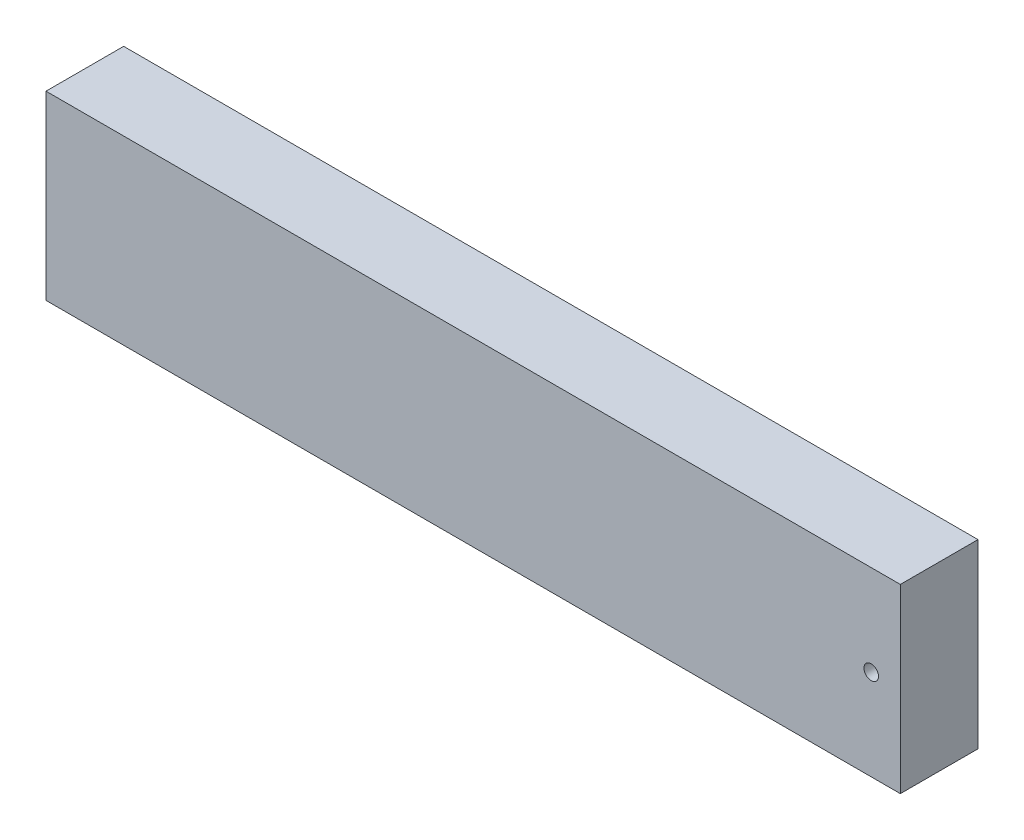
ISO-10303-21;
HEADER;
FILE_DESCRIPTION(('STEP AP214'),'2;1');
FILE_NAME('part.step','',(''),(''),'','','');
FILE_SCHEMA(('AUTOMOTIVE_DESIGN { 1 0 10303 214 1 1 1 1 }'));
ENDSEC;
DATA;
#1=APPLICATION_CONTEXT('core data for automotive mechanical design processes');
#2=APPLICATION_PROTOCOL_DEFINITION('international standard','automotive_design',2000,#1);
#3=PRODUCT_CONTEXT('',#1,'mechanical');
#4=PRODUCT('Part','Part','',(#3));
#5=PRODUCT_RELATED_PRODUCT_CATEGORY('part','',(#4));
#6=PRODUCT_DEFINITION_FORMATION('','',#4);
#7=PRODUCT_DEFINITION_CONTEXT('part definition',#1,'design');
#8=PRODUCT_DEFINITION('design','',#6,#7);
#9=PRODUCT_DEFINITION_SHAPE('','',#8);
#10=(LENGTH_UNIT() NAMED_UNIT(*) SI_UNIT(.MILLI.,.METRE.));
#11=(NAMED_UNIT(*) PLANE_ANGLE_UNIT() SI_UNIT($,.RADIAN.));
#12=(NAMED_UNIT(*) SI_UNIT($,.STERADIAN.) SOLID_ANGLE_UNIT());
#13=UNCERTAINTY_MEASURE_WITH_UNIT(LENGTH_MEASURE(1.E-05),#10,'distance_accuracy_value','');
#14=(GEOMETRIC_REPRESENTATION_CONTEXT(3) GLOBAL_UNCERTAINTY_ASSIGNED_CONTEXT((#13)) GLOBAL_UNIT_ASSIGNED_CONTEXT((#10,
#11,#12)) REPRESENTATION_CONTEXT('',''));
#15=CARTESIAN_POINT('',(0.,0.,0.));
#16=DIRECTION('',(0.,0.,1.));
#17=DIRECTION('',(1.,0.,0.));
#18=AXIS2_PLACEMENT_3D('',#15,#16,#17);
#19=CARTESIAN_POINT('',(419.1,0.,38.1));
#20=DIRECTION('',(0.,1.,0.));
#21=DIRECTION('',(-1.,0.,0.));
#22=AXIS2_PLACEMENT_3D('',#19,#20,#21);
#23=PLANE('',#22);
#24=DIRECTION('',(1.,0.,0.));
#25=VECTOR('',#24,1.);
#26=CARTESIAN_POINT('',(419.1,0.,0.));
#27=LINE('',#26,#25);
#28=CARTESIAN_POINT('',(0.,0.,0.));
#29=VERTEX_POINT('',#28);
#30=CARTESIAN_POINT('',(419.1,0.,0.));
#31=VERTEX_POINT('',#30);
#32=EDGE_CURVE('E100',#29,#31,#27,.T.);
#33=ORIENTED_EDGE('',*,*,#32,.T.);
#34=DIRECTION('',(0.,0.,-1.));
#35=VECTOR('',#34,1.);
#36=CARTESIAN_POINT('',(419.1,0.,38.1));
#37=LINE('',#36,#35);
#38=CARTESIAN_POINT('',(419.1,0.,38.1));
#39=VERTEX_POINT('',#38);
#40=EDGE_CURVE('E11',#39,#31,#37,.T.);
#41=ORIENTED_EDGE('',*,*,#40,.F.);
#42=DIRECTION('',(1.,0.,0.));
#43=VECTOR('',#42,1.);
#44=CARTESIAN_POINT('',(419.1,0.,38.1));
#45=LINE('',#44,#43);
#46=CARTESIAN_POINT('',(0.,0.,38.1));
#47=VERTEX_POINT('',#46);
#48=EDGE_CURVE('E88',#47,#39,#45,.T.);
#49=ORIENTED_EDGE('',*,*,#48,.F.);
#50=DIRECTION('',(0.,0.,-1.));
#51=VECTOR('',#50,1.);
#52=CARTESIAN_POINT('',(0.,0.,38.1));
#53=LINE('',#52,#51);
#54=EDGE_CURVE('E96',#47,#29,#53,.T.);
#55=ORIENTED_EDGE('',*,*,#54,.T.);
#56=EDGE_LOOP('',(#33,#41,#49,#55));
#57=FACE_BOUND('',#56,.T.);
#58=ADVANCED_FACE('F37',(#57),#23,.F.);
#59=CARTESIAN_POINT('',(419.1,88.9,38.1));
#60=DIRECTION('',(-1.,0.,0.));
#61=DIRECTION('',(0.,0.,1.));
#62=AXIS2_PLACEMENT_3D('',#59,#60,#61);
#63=PLANE('',#62);
#64=DIRECTION('',(0.,1.,0.));
#65=VECTOR('',#64,1.);
#66=CARTESIAN_POINT('',(419.1,88.9,0.));
#67=LINE('',#66,#65);
#68=CARTESIAN_POINT('',(419.1,88.9,0.));
#69=VERTEX_POINT('',#68);
#70=EDGE_CURVE('E92',#31,#69,#67,.T.);
#71=ORIENTED_EDGE('',*,*,#70,.T.);
#72=DIRECTION('',(0.,0.,-1.));
#73=VECTOR('',#72,1.);
#74=CARTESIAN_POINT('',(419.1,88.9,38.1));
#75=LINE('',#74,#73);
#76=CARTESIAN_POINT('',(419.1,88.9,38.1));
#77=VERTEX_POINT('',#76);
#78=EDGE_CURVE('E45',#77,#69,#75,.T.);
#79=ORIENTED_EDGE('',*,*,#78,.F.);
#80=DIRECTION('',(0.,1.,0.));
#81=VECTOR('',#80,1.);
#82=CARTESIAN_POINT('',(419.1,88.9,38.1));
#83=LINE('',#82,#81);
#84=EDGE_CURVE('E83',#39,#77,#83,.T.);
#85=ORIENTED_EDGE('',*,*,#84,.F.);
#86=ORIENTED_EDGE('',*,*,#40,.T.);
#87=EDGE_LOOP('',(#71,#79,#85,#86));
#88=FACE_BOUND('',#87,.T.);
#89=ADVANCED_FACE('F91',(#88),#63,.F.);
#90=CARTESIAN_POINT('',(0.,88.9,38.1));
#91=DIRECTION('',(0.,-1.,0.));
#92=DIRECTION('',(0.,0.,-1.));
#93=AXIS2_PLACEMENT_3D('',#90,#91,#92);
#94=PLANE('',#93);
#95=DIRECTION('',(-1.,0.,0.));
#96=VECTOR('',#95,1.);
#97=CARTESIAN_POINT('',(0.,88.9,0.));
#98=LINE('',#97,#96);
#99=CARTESIAN_POINT('',(0.,88.9,0.));
#100=VERTEX_POINT('',#99);
#101=EDGE_CURVE('E70',#69,#100,#98,.T.);
#102=ORIENTED_EDGE('',*,*,#101,.T.);
#103=DIRECTION('',(0.,0.,-1.));
#104=VECTOR('',#103,1.);
#105=CARTESIAN_POINT('',(0.,88.9,38.1));
#106=LINE('',#105,#104);
#107=CARTESIAN_POINT('',(0.,88.9,38.1));
#108=VERTEX_POINT('',#107);
#109=EDGE_CURVE('E93',#108,#100,#106,.T.);
#110=ORIENTED_EDGE('',*,*,#109,.F.);
#111=DIRECTION('',(-1.,0.,0.));
#112=VECTOR('',#111,1.);
#113=CARTESIAN_POINT('',(0.,88.9,38.1));
#114=LINE('',#113,#112);
#115=EDGE_CURVE('E86',#77,#108,#114,.T.);
#116=ORIENTED_EDGE('',*,*,#115,.F.);
#117=ORIENTED_EDGE('',*,*,#78,.T.);
#118=EDGE_LOOP('',(#102,#110,#116,#117));
#119=FACE_BOUND('',#118,.T.);
#120=ADVANCED_FACE('F94',(#119),#94,.F.);
#121=CARTESIAN_POINT('',(0.,0.,38.1));
#122=DIRECTION('',(1.,0.,0.));
#123=DIRECTION('',(0.,0.,-1.));
#124=AXIS2_PLACEMENT_3D('',#121,#122,#123);
#125=PLANE('',#124);
#126=DIRECTION('',(0.,-1.,0.));
#127=VECTOR('',#126,1.);
#128=CARTESIAN_POINT('',(0.,0.,0.));
#129=LINE('',#128,#127);
#130=EDGE_CURVE('E76',#100,#29,#129,.T.);
#131=ORIENTED_EDGE('',*,*,#130,.T.);
#132=ORIENTED_EDGE('',*,*,#54,.F.);
#133=DIRECTION('',(0.,-1.,0.));
#134=VECTOR('',#133,1.);
#135=CARTESIAN_POINT('',(0.,0.,38.1));
#136=LINE('',#135,#134);
#137=EDGE_CURVE('E53',#108,#47,#136,.T.);
#138=ORIENTED_EDGE('',*,*,#137,.F.);
#139=ORIENTED_EDGE('',*,*,#109,.T.);
#140=EDGE_LOOP('',(#131,#132,#138,#139));
#141=FACE_BOUND('',#140,.T.);
#142=ADVANCED_FACE('F108',(#141),#125,.F.);
#143=CARTESIAN_POINT('',(0.,0.,38.1));
#144=DIRECTION('',(0.,0.,-1.));
#145=DIRECTION('',(-1.,0.,0.));
#146=AXIS2_PLACEMENT_3D('',#143,#144,#145);
#147=PLANE('',#146);
#148=CARTESIAN_POINT('',(404.8125,44.45,38.1));
#149=DIRECTION('',(0.,0.,1.));
#150=DIRECTION('',(1.,0.,0.));
#151=AXIS2_PLACEMENT_3D('',#148,#149,#150);
#152=CIRCLE('',#151,3.571875);
#153=CARTESIAN_POINT('',(408.384375,44.45,38.1));
#154=VERTEX_POINT('',#153);
#155=EDGE_CURVE('E116',#154,#154,#152,.T.);
#156=ORIENTED_EDGE('',*,*,#155,.F.);
#157=EDGE_LOOP('',(#156));
#158=FACE_BOUND('',#157,.T.);
#159=ORIENTED_EDGE('',*,*,#48,.T.);
#160=ORIENTED_EDGE('',*,*,#84,.T.);
#161=ORIENTED_EDGE('',*,*,#115,.T.);
#162=ORIENTED_EDGE('',*,*,#137,.T.);
#163=EDGE_LOOP('',(#159,#160,#161,#162));
#164=FACE_BOUND('',#163,.T.);
#165=ADVANCED_FACE('F84',(#158,#164),#147,.F.);
#166=CARTESIAN_POINT('',(0.,0.,0.));
#167=DIRECTION('',(0.,0.,-1.));
#168=DIRECTION('',(-1.,0.,0.));
#169=AXIS2_PLACEMENT_3D('',#166,#167,#168);
#170=PLANE('',#169);
#171=CARTESIAN_POINT('',(404.8125,44.45,0.));
#172=DIRECTION('',(0.,0.,1.));
#173=DIRECTION('',(1.,0.,0.));
#174=AXIS2_PLACEMENT_3D('',#171,#172,#173);
#175=CIRCLE('',#174,3.571875);
#176=CARTESIAN_POINT('',(408.384375,44.45,0.));
#177=VERTEX_POINT('',#176);
#178=EDGE_CURVE('E103',#177,#177,#175,.T.);
#179=ORIENTED_EDGE('',*,*,#178,.T.);
#180=EDGE_LOOP('',(#179));
#181=FACE_BOUND('',#180,.T.);
#182=ORIENTED_EDGE('',*,*,#32,.F.);
#183=ORIENTED_EDGE('',*,*,#130,.F.);
#184=ORIENTED_EDGE('',*,*,#101,.F.);
#185=ORIENTED_EDGE('',*,*,#70,.F.);
#186=EDGE_LOOP('',(#182,#183,#184,#185));
#187=FACE_BOUND('',#186,.T.);
#188=ADVANCED_FACE('F111',(#181,#187),#170,.T.);
#189=CARTESIAN_POINT('',(404.8125,44.45,38.1));
#190=DIRECTION('',(0.,0.,1.));
#191=DIRECTION('',(1.,0.,0.));
#192=AXIS2_PLACEMENT_3D('',#189,#190,#191);
#193=CYLINDRICAL_SURFACE('',#192,3.571875);
#194=ORIENTED_EDGE('',*,*,#178,.F.);
#195=EDGE_LOOP('',(#194));
#196=FACE_BOUND('',#195,.T.);
#197=ORIENTED_EDGE('',*,*,#155,.T.);
#198=EDGE_LOOP('',(#197));
#199=FACE_BOUND('',#198,.T.);
#200=ADVANCED_FACE('F120',(#196,#199),#193,.F.);
#201=CLOSED_SHELL('',(#58,#89,#120,#142,#165,#188,#200));
#202=MANIFOLD_SOLID_BREP('B2',#201);
#203=ADVANCED_BREP_SHAPE_REPRESENTATION('',(#18,#202),#14);
#204=SHAPE_DEFINITION_REPRESENTATION(#9,#203);
ENDSEC;
END-ISO-10303-21;
